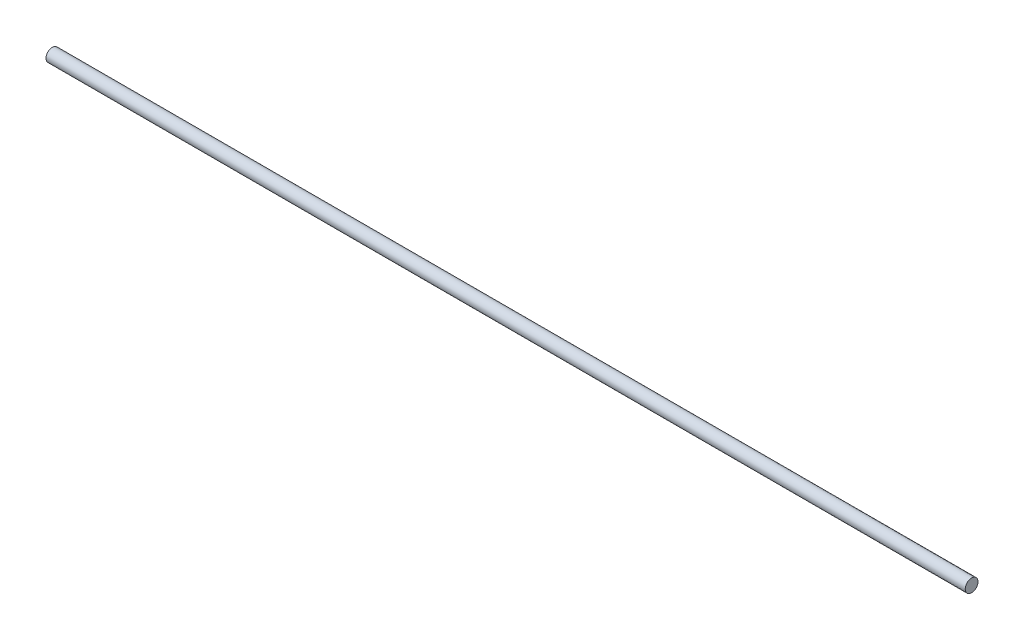
ISO-10303-21;
HEADER;
FILE_DESCRIPTION(('STEP AP214'),'2;1');
FILE_NAME('part.step','',(''),(''),'','','');
FILE_SCHEMA(('AUTOMOTIVE_DESIGN { 1 0 10303 214 1 1 1 1 }'));
ENDSEC;
DATA;
#1=APPLICATION_CONTEXT('core data for automotive mechanical design processes');
#2=APPLICATION_PROTOCOL_DEFINITION('international standard','automotive_design',2000,#1);
#3=PRODUCT_CONTEXT('',#1,'mechanical');
#4=PRODUCT('Part','Part','',(#3));
#5=PRODUCT_RELATED_PRODUCT_CATEGORY('part','',(#4));
#6=PRODUCT_DEFINITION_FORMATION('','',#4);
#7=PRODUCT_DEFINITION_CONTEXT('part definition',#1,'design');
#8=PRODUCT_DEFINITION('design','',#6,#7);
#9=PRODUCT_DEFINITION_SHAPE('','',#8);
#10=(LENGTH_UNIT() NAMED_UNIT(*) SI_UNIT(.MILLI.,.METRE.));
#11=(NAMED_UNIT(*) PLANE_ANGLE_UNIT() SI_UNIT($,.RADIAN.));
#12=(NAMED_UNIT(*) SI_UNIT($,.STERADIAN.) SOLID_ANGLE_UNIT());
#13=UNCERTAINTY_MEASURE_WITH_UNIT(LENGTH_MEASURE(1.E-05),#10,'distance_accuracy_value','');
#14=(GEOMETRIC_REPRESENTATION_CONTEXT(3) GLOBAL_UNCERTAINTY_ASSIGNED_CONTEXT((#13)) GLOBAL_UNIT_ASSIGNED_CONTEXT((#10,
#11,#12)) REPRESENTATION_CONTEXT('',''));
#15=CARTESIAN_POINT('',(0.,0.,0.));
#16=DIRECTION('',(0.,0.,1.));
#17=DIRECTION('',(1.,0.,0.));
#18=AXIS2_PLACEMENT_3D('',#15,#16,#17);
#19=CARTESIAN_POINT('',(457.2,0.,0.));
#20=DIRECTION('',(-1.,0.,0.));
#21=DIRECTION('',(0.,0.,1.));
#22=AXIS2_PLACEMENT_3D('',#19,#20,#21);
#23=CYLINDRICAL_SURFACE('',#22,6.35);
#24=CARTESIAN_POINT('',(457.2,0.,0.));
#25=DIRECTION('',(1.,0.,0.));
#26=DIRECTION('',(0.,0.,-1.));
#27=AXIS2_PLACEMENT_3D('',#24,#25,#26);
#28=CIRCLE('',#27,6.35);
#29=CARTESIAN_POINT('',(457.2,0.,-6.35));
#30=VERTEX_POINT('',#29);
#31=EDGE_CURVE('E10',#30,#30,#28,.T.);
#32=ORIENTED_EDGE('',*,*,#31,.F.);
#33=EDGE_LOOP('',(#32));
#34=FACE_BOUND('',#33,.T.);
#35=CARTESIAN_POINT('',(-457.2,0.,0.));
#36=DIRECTION('',(1.,0.,0.));
#37=DIRECTION('',(0.,0.,-1.));
#38=AXIS2_PLACEMENT_3D('',#35,#36,#37);
#39=CIRCLE('',#38,6.35);
#40=CARTESIAN_POINT('',(-457.2,0.,-6.35));
#41=VERTEX_POINT('',#40);
#42=EDGE_CURVE('E33',#41,#41,#39,.T.);
#43=ORIENTED_EDGE('',*,*,#42,.T.);
#44=EDGE_LOOP('',(#43));
#45=FACE_BOUND('',#44,.T.);
#46=ADVANCED_FACE('F30',(#34,#45),#23,.T.);
#47=CARTESIAN_POINT('',(457.2,0.,0.));
#48=DIRECTION('',(1.,0.,0.));
#49=DIRECTION('',(0.,0.,-1.));
#50=AXIS2_PLACEMENT_3D('',#47,#48,#49);
#51=PLANE('',#50);
#52=ORIENTED_EDGE('',*,*,#31,.T.);
#53=EDGE_LOOP('',(#52));
#54=FACE_BOUND('',#53,.T.);
#55=ADVANCED_FACE('F45',(#54),#51,.T.);
#56=CARTESIAN_POINT('',(-457.2,0.,0.));
#57=DIRECTION('',(1.,0.,0.));
#58=DIRECTION('',(0.,0.,-1.));
#59=AXIS2_PLACEMENT_3D('',#56,#57,#58);
#60=PLANE('',#59);
#61=ORIENTED_EDGE('',*,*,#42,.F.);
#62=EDGE_LOOP('',(#61));
#63=FACE_BOUND('',#62,.T.);
#64=ADVANCED_FACE('F43',(#63),#60,.F.);
#65=CLOSED_SHELL('',(#46,#55,#64));
#66=MANIFOLD_SOLID_BREP('B2',#65);
#67=ADVANCED_BREP_SHAPE_REPRESENTATION('',(#18,#66),#14);
#68=SHAPE_DEFINITION_REPRESENTATION(#9,#67);
ENDSEC;
END-ISO-10303-21;
